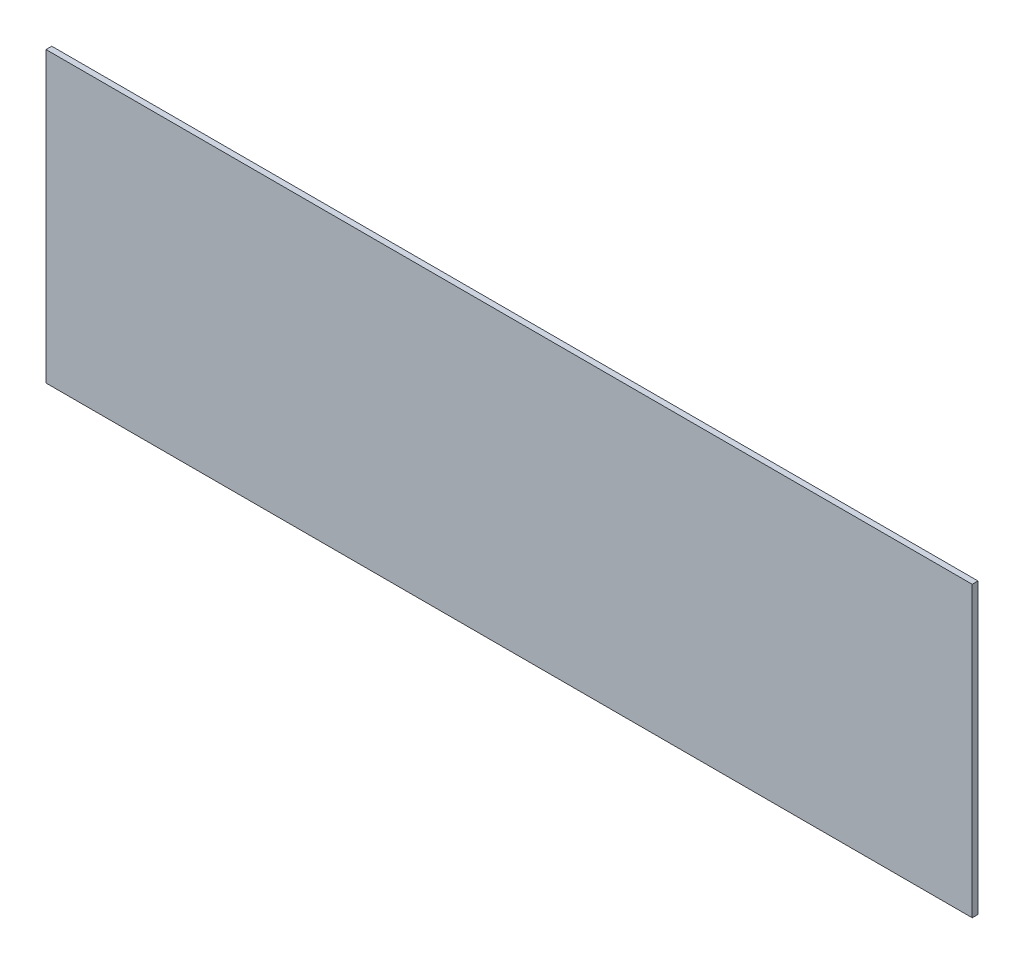
ISO-10303-21;
HEADER;
FILE_DESCRIPTION(('STEP AP214'),'2;1');
FILE_NAME('part.step','',(''),(''),'','','');
FILE_SCHEMA(('AUTOMOTIVE_DESIGN { 1 0 10303 214 1 1 1 1 }'));
ENDSEC;
DATA;
#1=APPLICATION_CONTEXT('core data for automotive mechanical design processes');
#2=APPLICATION_PROTOCOL_DEFINITION('international standard','automotive_design',2000,#1);
#3=PRODUCT_CONTEXT('',#1,'mechanical');
#4=PRODUCT('Part','Part','',(#3));
#5=PRODUCT_RELATED_PRODUCT_CATEGORY('part','',(#4));
#6=PRODUCT_DEFINITION_FORMATION('','',#4);
#7=PRODUCT_DEFINITION_CONTEXT('part definition',#1,'design');
#8=PRODUCT_DEFINITION('design','',#6,#7);
#9=PRODUCT_DEFINITION_SHAPE('','',#8);
#10=(LENGTH_UNIT() NAMED_UNIT(*) SI_UNIT(.MILLI.,.METRE.));
#11=(NAMED_UNIT(*) PLANE_ANGLE_UNIT() SI_UNIT($,.RADIAN.));
#12=(NAMED_UNIT(*) SI_UNIT($,.STERADIAN.) SOLID_ANGLE_UNIT());
#13=UNCERTAINTY_MEASURE_WITH_UNIT(LENGTH_MEASURE(1.E-05),#10,'distance_accuracy_value','');
#14=(GEOMETRIC_REPRESENTATION_CONTEXT(3) GLOBAL_UNCERTAINTY_ASSIGNED_CONTEXT((#13)) GLOBAL_UNIT_ASSIGNED_CONTEXT((#10,
#11,#12)) REPRESENTATION_CONTEXT('',''));
#15=CARTESIAN_POINT('',(0.,0.,0.));
#16=DIRECTION('',(0.,0.,1.));
#17=DIRECTION('',(1.,0.,0.));
#18=AXIS2_PLACEMENT_3D('',#15,#16,#17);
#19=CARTESIAN_POINT('',(481.,150.,6.));
#20=DIRECTION('',(-1.,0.,0.));
#21=DIRECTION('',(0.,-1.,0.));
#22=AXIS2_PLACEMENT_3D('',#19,#20,#21);
#23=PLANE('',#22);
#24=DIRECTION('',(0.,1.,0.));
#25=VECTOR('',#24,1.);
#26=CARTESIAN_POINT('',(481.,150.,0.));
#27=LINE('',#26,#25);
#28=CARTESIAN_POINT('',(481.,-150.,0.));
#29=VERTEX_POINT('',#28);
#30=CARTESIAN_POINT('',(481.,150.,0.));
#31=VERTEX_POINT('',#30);
#32=EDGE_CURVE('E98',#29,#31,#27,.T.);
#33=ORIENTED_EDGE('',*,*,#32,.T.);
#34=DIRECTION('',(0.,0.,-1.));
#35=VECTOR('',#34,1.);
#36=CARTESIAN_POINT('',(481.,150.,6.));
#37=LINE('',#36,#35);
#38=CARTESIAN_POINT('',(481.,150.,6.));
#39=VERTEX_POINT('',#38);
#40=EDGE_CURVE('E11',#39,#31,#37,.T.);
#41=ORIENTED_EDGE('',*,*,#40,.F.);
#42=DIRECTION('',(0.,1.,0.));
#43=VECTOR('',#42,1.);
#44=CARTESIAN_POINT('',(481.,150.,6.));
#45=LINE('',#44,#43);
#46=CARTESIAN_POINT('',(481.,-150.,6.));
#47=VERTEX_POINT('',#46);
#48=EDGE_CURVE('E86',#47,#39,#45,.T.);
#49=ORIENTED_EDGE('',*,*,#48,.F.);
#50=DIRECTION('',(0.,0.,-1.));
#51=VECTOR('',#50,1.);
#52=CARTESIAN_POINT('',(481.,-150.,6.));
#53=LINE('',#52,#51);
#54=EDGE_CURVE('E94',#47,#29,#53,.T.);
#55=ORIENTED_EDGE('',*,*,#54,.T.);
#56=EDGE_LOOP('',(#33,#41,#49,#55));
#57=FACE_BOUND('',#56,.T.);
#58=ADVANCED_FACE('F35',(#57),#23,.F.);
#59=CARTESIAN_POINT('',(-481.,150.,6.));
#60=DIRECTION('',(0.,-1.,0.));
#61=DIRECTION('',(0.,0.,-1.));
#62=AXIS2_PLACEMENT_3D('',#59,#60,#61);
#63=PLANE('',#62);
#64=DIRECTION('',(-1.,0.,0.));
#65=VECTOR('',#64,1.);
#66=CARTESIAN_POINT('',(-481.,150.,0.));
#67=LINE('',#66,#65);
#68=CARTESIAN_POINT('',(-481.,150.,0.));
#69=VERTEX_POINT('',#68);
#70=EDGE_CURVE('E90',#31,#69,#67,.T.);
#71=ORIENTED_EDGE('',*,*,#70,.T.);
#72=DIRECTION('',(0.,0.,-1.));
#73=VECTOR('',#72,1.);
#74=CARTESIAN_POINT('',(-481.,150.,6.));
#75=LINE('',#74,#73);
#76=CARTESIAN_POINT('',(-481.,150.,6.));
#77=VERTEX_POINT('',#76);
#78=EDGE_CURVE('E43',#77,#69,#75,.T.);
#79=ORIENTED_EDGE('',*,*,#78,.F.);
#80=DIRECTION('',(-1.,0.,0.));
#81=VECTOR('',#80,1.);
#82=CARTESIAN_POINT('',(-481.,150.,6.));
#83=LINE('',#82,#81);
#84=EDGE_CURVE('E81',#39,#77,#83,.T.);
#85=ORIENTED_EDGE('',*,*,#84,.F.);
#86=ORIENTED_EDGE('',*,*,#40,.T.);
#87=EDGE_LOOP('',(#71,#79,#85,#86));
#88=FACE_BOUND('',#87,.T.);
#89=ADVANCED_FACE('F89',(#88),#63,.F.);
#90=CARTESIAN_POINT('',(-481.,150.,6.));
#91=DIRECTION('',(1.,0.,0.));
#92=DIRECTION('',(0.,1.,0.));
#93=AXIS2_PLACEMENT_3D('',#90,#91,#92);
#94=PLANE('',#93);
#95=DIRECTION('',(0.,-1.,0.));
#96=VECTOR('',#95,1.);
#97=CARTESIAN_POINT('',(-481.,150.,0.));
#98=LINE('',#97,#96);
#99=CARTESIAN_POINT('',(-481.,-150.,0.));
#100=VERTEX_POINT('',#99);
#101=EDGE_CURVE('E68',#69,#100,#98,.T.);
#102=ORIENTED_EDGE('',*,*,#101,.T.);
#103=DIRECTION('',(0.,0.,-1.));
#104=VECTOR('',#103,1.);
#105=CARTESIAN_POINT('',(-481.,-150.,6.));
#106=LINE('',#105,#104);
#107=CARTESIAN_POINT('',(-481.,-150.,6.));
#108=VERTEX_POINT('',#107);
#109=EDGE_CURVE('E91',#108,#100,#106,.T.);
#110=ORIENTED_EDGE('',*,*,#109,.F.);
#111=DIRECTION('',(0.,-1.,0.));
#112=VECTOR('',#111,1.);
#113=CARTESIAN_POINT('',(-481.,150.,6.));
#114=LINE('',#113,#112);
#115=EDGE_CURVE('E84',#77,#108,#114,.T.);
#116=ORIENTED_EDGE('',*,*,#115,.F.);
#117=ORIENTED_EDGE('',*,*,#78,.T.);
#118=EDGE_LOOP('',(#102,#110,#116,#117));
#119=FACE_BOUND('',#118,.T.);
#120=ADVANCED_FACE('F92',(#119),#94,.F.);
#121=CARTESIAN_POINT('',(-481.,-150.,6.));
#122=DIRECTION('',(0.,1.,0.));
#123=DIRECTION('',(0.,0.,1.));
#124=AXIS2_PLACEMENT_3D('',#121,#122,#123);
#125=PLANE('',#124);
#126=DIRECTION('',(1.,0.,0.));
#127=VECTOR('',#126,1.);
#128=CARTESIAN_POINT('',(-481.,-150.,0.));
#129=LINE('',#128,#127);
#130=EDGE_CURVE('E74',#100,#29,#129,.T.);
#131=ORIENTED_EDGE('',*,*,#130,.T.);
#132=ORIENTED_EDGE('',*,*,#54,.F.);
#133=DIRECTION('',(1.,0.,0.));
#134=VECTOR('',#133,1.);
#135=CARTESIAN_POINT('',(-481.,-150.,6.));
#136=LINE('',#135,#134);
#137=EDGE_CURVE('E51',#108,#47,#136,.T.);
#138=ORIENTED_EDGE('',*,*,#137,.F.);
#139=ORIENTED_EDGE('',*,*,#109,.T.);
#140=EDGE_LOOP('',(#131,#132,#138,#139));
#141=FACE_BOUND('',#140,.T.);
#142=ADVANCED_FACE('F105',(#141),#125,.F.);
#143=CARTESIAN_POINT('',(0.,0.,6.));
#144=DIRECTION('',(0.,0.,1.));
#145=DIRECTION('',(1.,0.,0.));
#146=AXIS2_PLACEMENT_3D('',#143,#144,#145);
#147=PLANE('',#146);
#148=ORIENTED_EDGE('',*,*,#48,.T.);
#149=ORIENTED_EDGE('',*,*,#84,.T.);
#150=ORIENTED_EDGE('',*,*,#115,.T.);
#151=ORIENTED_EDGE('',*,*,#137,.T.);
#152=EDGE_LOOP('',(#148,#149,#150,#151));
#153=FACE_BOUND('',#152,.T.);
#154=ADVANCED_FACE('F82',(#153),#147,.T.);
#155=CARTESIAN_POINT('',(0.,0.,0.));
#156=DIRECTION('',(0.,0.,1.));
#157=DIRECTION('',(1.,0.,0.));
#158=AXIS2_PLACEMENT_3D('',#155,#156,#157);
#159=PLANE('',#158);
#160=ORIENTED_EDGE('',*,*,#32,.F.);
#161=ORIENTED_EDGE('',*,*,#130,.F.);
#162=ORIENTED_EDGE('',*,*,#101,.F.);
#163=ORIENTED_EDGE('',*,*,#70,.F.);
#164=EDGE_LOOP('',(#160,#161,#162,#163));
#165=FACE_BOUND('',#164,.T.);
#166=ADVANCED_FACE('F108',(#165),#159,.F.);
#167=CLOSED_SHELL('',(#58,#89,#120,#142,#154,#166));
#168=MANIFOLD_SOLID_BREP('B2',#167);
#169=ADVANCED_BREP_SHAPE_REPRESENTATION('',(#18,#168),#14);
#170=SHAPE_DEFINITION_REPRESENTATION(#9,#169);
ENDSEC;
END-ISO-10303-21;
